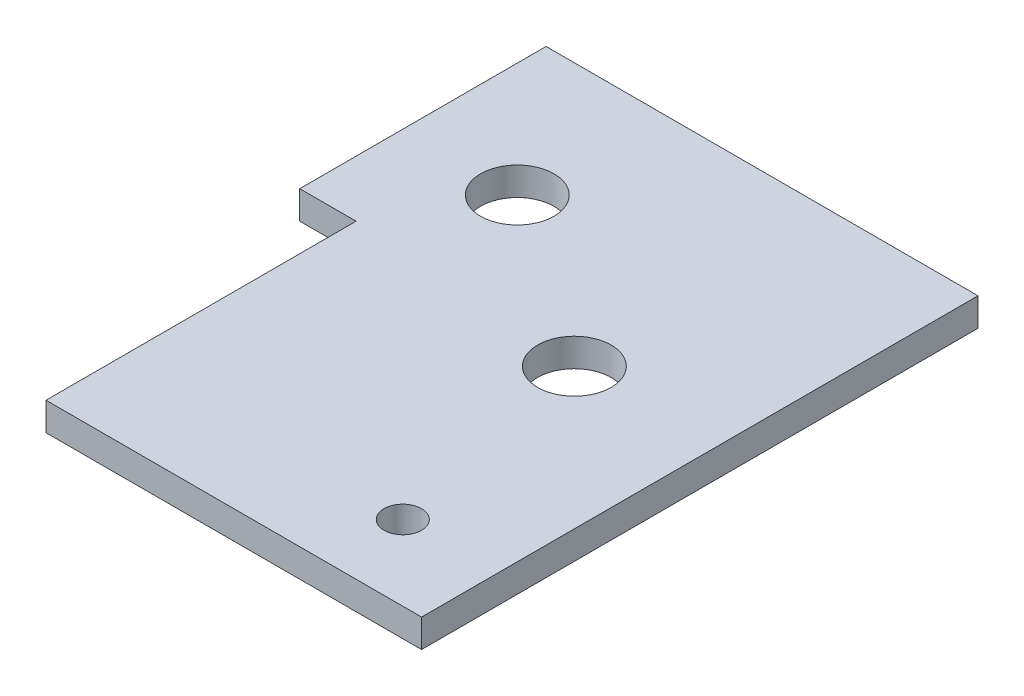
ISO-10303-21;
HEADER;
FILE_DESCRIPTION(('STEP AP214'),'2;1');
FILE_NAME('part.step','',(''),(''),'','','');
FILE_SCHEMA(('AUTOMOTIVE_DESIGN { 1 0 10303 214 1 1 1 1 }'));
ENDSEC;
DATA;
#1=APPLICATION_CONTEXT('core data for automotive mechanical design processes');
#2=APPLICATION_PROTOCOL_DEFINITION('international standard','automotive_design',2000,#1);
#3=PRODUCT_CONTEXT('',#1,'mechanical');
#4=PRODUCT('Part','Part','',(#3));
#5=PRODUCT_RELATED_PRODUCT_CATEGORY('part','',(#4));
#6=PRODUCT_DEFINITION_FORMATION('','',#4);
#7=PRODUCT_DEFINITION_CONTEXT('part definition',#1,'design');
#8=PRODUCT_DEFINITION('design','',#6,#7);
#9=PRODUCT_DEFINITION_SHAPE('','',#8);
#10=(LENGTH_UNIT() NAMED_UNIT(*) SI_UNIT(.MILLI.,.METRE.));
#11=(NAMED_UNIT(*) PLANE_ANGLE_UNIT() SI_UNIT($,.RADIAN.));
#12=(NAMED_UNIT(*) SI_UNIT($,.STERADIAN.) SOLID_ANGLE_UNIT());
#13=UNCERTAINTY_MEASURE_WITH_UNIT(LENGTH_MEASURE(1.E-05),#10,'distance_accuracy_value','');
#14=(GEOMETRIC_REPRESENTATION_CONTEXT(3) GLOBAL_UNCERTAINTY_ASSIGNED_CONTEXT((#13)) GLOBAL_UNIT_ASSIGNED_CONTEXT((#10,
#11,#12)) REPRESENTATION_CONTEXT('',''));
#15=CARTESIAN_POINT('',(0.,0.,0.));
#16=DIRECTION('',(0.,0.,1.));
#17=DIRECTION('',(1.,0.,0.));
#18=AXIS2_PLACEMENT_3D('',#15,#16,#17);
#19=CARTESIAN_POINT('',(0.,3.,-32.2957006320331));
#20=DIRECTION('',(0.,0.,-1.));
#21=DIRECTION('',(-1.,0.,0.));
#22=AXIS2_PLACEMENT_3D('',#19,#20,#21);
#23=PLANE('',#22);
#24=DIRECTION('',(1.,0.,0.));
#25=VECTOR('',#24,1.);
#26=CARTESIAN_POINT('',(0.,0.,-32.2957006320331));
#27=LINE('',#26,#25);
#28=CARTESIAN_POINT('',(106.296761577572,0.,-32.2957006320331));
#29=VERTEX_POINT('',#28);
#30=CARTESIAN_POINT('',(152.296761577573,0.,-32.2957006320331));
#31=VERTEX_POINT('',#30);
#32=EDGE_CURVE('E128',#29,#31,#27,.T.);
#33=ORIENTED_EDGE('',*,*,#32,.F.);
#34=DIRECTION('',(0.,-1.,0.));
#35=VECTOR('',#34,1.);
#36=CARTESIAN_POINT('',(106.296761577572,3.,-32.2957006320331));
#37=LINE('',#36,#35);
#38=CARTESIAN_POINT('',(106.296761577572,3.,-32.2957006320331));
#39=VERTEX_POINT('',#38);
#40=EDGE_CURVE('E11',#39,#29,#37,.T.);
#41=ORIENTED_EDGE('',*,*,#40,.F.);
#42=DIRECTION('',(1.,0.,0.));
#43=VECTOR('',#42,1.);
#44=CARTESIAN_POINT('',(0.,3.,-32.2957006320331));
#45=LINE('',#44,#43);
#46=CARTESIAN_POINT('',(152.296761577573,3.,-32.2957006320331));
#47=VERTEX_POINT('',#46);
#48=EDGE_CURVE('E149',#39,#47,#45,.T.);
#49=ORIENTED_EDGE('',*,*,#48,.T.);
#50=DIRECTION('',(0.,-1.,0.));
#51=VECTOR('',#50,1.);
#52=CARTESIAN_POINT('',(152.296761577573,3.,-32.2957006320331));
#53=LINE('',#52,#51);
#54=EDGE_CURVE('E80',#47,#31,#53,.T.);
#55=ORIENTED_EDGE('',*,*,#54,.T.);
#56=EDGE_LOOP('',(#33,#41,#49,#55));
#57=FACE_BOUND('',#56,.T.);
#58=ADVANCED_FACE('F36',(#57),#23,.T.);
#59=CARTESIAN_POINT('',(106.296761577572,3.,0.));
#60=DIRECTION('',(1.,0.,0.));
#61=DIRECTION('',(0.,0.,-1.));
#62=AXIS2_PLACEMENT_3D('',#59,#60,#61);
#63=PLANE('',#62);
#64=DIRECTION('',(0.,0.,1.));
#65=VECTOR('',#64,1.);
#66=CARTESIAN_POINT('',(106.296761577572,0.,0.));
#67=LINE('',#66,#65);
#68=CARTESIAN_POINT('',(106.296761577572,0.,-6.05517733110575));
#69=VERTEX_POINT('',#68);
#70=EDGE_CURVE('E131',#29,#69,#67,.T.);
#71=ORIENTED_EDGE('',*,*,#70,.T.);
#72=DIRECTION('',(0.,-1.,0.));
#73=VECTOR('',#72,1.);
#74=CARTESIAN_POINT('',(106.296761577572,3.,-6.05517733110575));
#75=LINE('',#74,#73);
#76=CARTESIAN_POINT('',(106.296761577572,3.,-6.05517733110575));
#77=VERTEX_POINT('',#76);
#78=EDGE_CURVE('E44',#77,#69,#75,.T.);
#79=ORIENTED_EDGE('',*,*,#78,.F.);
#80=DIRECTION('',(0.,0.,1.));
#81=VECTOR('',#80,1.);
#82=CARTESIAN_POINT('',(106.296761577572,3.,0.));
#83=LINE('',#82,#81);
#84=EDGE_CURVE('E163',#39,#77,#83,.T.);
#85=ORIENTED_EDGE('',*,*,#84,.F.);
#86=ORIENTED_EDGE('',*,*,#40,.T.);
#87=EDGE_LOOP('',(#71,#79,#85,#86));
#88=FACE_BOUND('',#87,.T.);
#89=ADVANCED_FACE('F166',(#88),#63,.F.);
#90=CARTESIAN_POINT('',(0.,3.,-6.05517733110575));
#91=DIRECTION('',(0.,0.,-1.));
#92=DIRECTION('',(-1.,0.,0.));
#93=AXIS2_PLACEMENT_3D('',#90,#91,#92);
#94=PLANE('',#93);
#95=DIRECTION('',(1.,0.,0.));
#96=VECTOR('',#95,1.);
#97=CARTESIAN_POINT('',(0.,0.,-6.05517733110575));
#98=LINE('',#97,#96);
#99=CARTESIAN_POINT('',(112.296761577573,0.,-6.05517733110575));
#100=VERTEX_POINT('',#99);
#101=EDGE_CURVE('E133',#69,#100,#98,.T.);
#102=ORIENTED_EDGE('',*,*,#101,.T.);
#103=DIRECTION('',(0.,-1.,0.));
#104=VECTOR('',#103,1.);
#105=CARTESIAN_POINT('',(112.296761577573,3.,-6.05517733110575));
#106=LINE('',#105,#104);
#107=CARTESIAN_POINT('',(112.296761577573,3.,-6.05517733110575));
#108=VERTEX_POINT('',#107);
#109=EDGE_CURVE('E112',#108,#100,#106,.T.);
#110=ORIENTED_EDGE('',*,*,#109,.F.);
#111=DIRECTION('',(1.,0.,0.));
#112=VECTOR('',#111,1.);
#113=CARTESIAN_POINT('',(0.,3.,-6.05517733110575));
#114=LINE('',#113,#112);
#115=EDGE_CURVE('E99',#77,#108,#114,.T.);
#116=ORIENTED_EDGE('',*,*,#115,.F.);
#117=ORIENTED_EDGE('',*,*,#78,.T.);
#118=EDGE_LOOP('',(#102,#110,#116,#117));
#119=FACE_BOUND('',#118,.T.);
#120=ADVANCED_FACE('F156',(#119),#94,.F.);
#121=CARTESIAN_POINT('',(112.296761577573,3.,3.30325947032491E-13));
#122=DIRECTION('',(1.,0.,0.));
#123=DIRECTION('',(0.,0.,-1.));
#124=AXIS2_PLACEMENT_3D('',#121,#122,#123);
#125=PLANE('',#124);
#126=DIRECTION('',(0.,0.,1.));
#127=VECTOR('',#126,1.);
#128=CARTESIAN_POINT('',(112.296761577573,0.,3.30325947032491E-13));
#129=LINE('',#128,#127);
#130=CARTESIAN_POINT('',(112.296761577573,0.,26.9698226688942));
#131=VERTEX_POINT('',#130);
#132=EDGE_CURVE('E108',#100,#131,#129,.T.);
#133=ORIENTED_EDGE('',*,*,#132,.T.);
#134=DIRECTION('',(0.,-1.,0.));
#135=VECTOR('',#134,1.);
#136=CARTESIAN_POINT('',(112.296761577573,3.,26.9698226688942));
#137=LINE('',#136,#135);
#138=CARTESIAN_POINT('',(112.296761577573,3.,26.9698226688942));
#139=VERTEX_POINT('',#138);
#140=EDGE_CURVE('E105',#139,#131,#137,.T.);
#141=ORIENTED_EDGE('',*,*,#140,.F.);
#142=DIRECTION('',(0.,0.,1.));
#143=VECTOR('',#142,1.);
#144=CARTESIAN_POINT('',(112.296761577573,3.,3.30325947032491E-13));
#145=LINE('',#144,#143);
#146=EDGE_CURVE('E92',#108,#139,#145,.T.);
#147=ORIENTED_EDGE('',*,*,#146,.F.);
#148=ORIENTED_EDGE('',*,*,#109,.T.);
#149=EDGE_LOOP('',(#133,#141,#147,#148));
#150=FACE_BOUND('',#149,.T.);
#151=ADVANCED_FACE('F106',(#150),#125,.F.);
#152=CARTESIAN_POINT('',(1.4035555357999E-13,3.,26.9698226688948));
#153=DIRECTION('',(0.,0.,1.));
#154=DIRECTION('',(1.,0.,0.));
#155=AXIS2_PLACEMENT_3D('',#152,#153,#154);
#156=PLANE('',#155);
#157=DIRECTION('',(-1.,0.,0.));
#158=VECTOR('',#157,1.);
#159=CARTESIAN_POINT('',(1.4035555357999E-13,0.,26.9698226688948));
#160=LINE('',#159,#158);
#161=CARTESIAN_POINT('',(152.296761577573,0.,26.969822668894));
#162=VERTEX_POINT('',#161);
#163=EDGE_CURVE('E136',#162,#131,#160,.T.);
#164=ORIENTED_EDGE('',*,*,#163,.F.);
#165=DIRECTION('',(0.,-1.,0.));
#166=VECTOR('',#165,1.);
#167=CARTESIAN_POINT('',(152.296761577573,3.,26.969822668894));
#168=LINE('',#167,#166);
#169=CARTESIAN_POINT('',(152.296761577573,3.,26.969822668894));
#170=VERTEX_POINT('',#169);
#171=EDGE_CURVE('E73',#170,#162,#168,.T.);
#172=ORIENTED_EDGE('',*,*,#171,.F.);
#173=DIRECTION('',(-1.,0.,0.));
#174=VECTOR('',#173,1.);
#175=CARTESIAN_POINT('',(1.4035555357999E-13,3.,26.9698226688948));
#176=LINE('',#175,#174);
#177=EDGE_CURVE('E97',#170,#139,#176,.T.);
#178=ORIENTED_EDGE('',*,*,#177,.T.);
#179=ORIENTED_EDGE('',*,*,#140,.T.);
#180=EDGE_LOOP('',(#164,#172,#178,#179));
#181=FACE_BOUND('',#180,.T.);
#182=ADVANCED_FACE('F114',(#181),#156,.T.);
#183=CARTESIAN_POINT('',(137.296761577573,3.,-4.30517733110572));
#184=DIRECTION('',(0.,-1.,0.));
#185=DIRECTION('',(0.,0.,-1.));
#186=AXIS2_PLACEMENT_3D('',#183,#184,#185);
#187=CYLINDRICAL_SURFACE('',#186,3.91500000000018);
#188=CARTESIAN_POINT('',(137.296761577573,3.,-4.30517733110572));
#189=DIRECTION('',(0.,1.,0.));
#190=DIRECTION('',(0.,0.,1.));
#191=AXIS2_PLACEMENT_3D('',#188,#189,#190);
#192=CIRCLE('',#191,3.91500000000018);
#193=CARTESIAN_POINT('',(137.296761577573,3.,-0.390177331105537));
#194=VERTEX_POINT('',#193);
#195=EDGE_CURVE('E122',#194,#194,#192,.F.);
#196=ORIENTED_EDGE('',*,*,#195,.F.);
#197=EDGE_LOOP('',(#196));
#198=FACE_BOUND('',#197,.T.);
#199=CARTESIAN_POINT('',(137.296761577573,0.,-4.30517733110572));
#200=DIRECTION('',(0.,1.,0.));
#201=DIRECTION('',(0.,0.,1.));
#202=AXIS2_PLACEMENT_3D('',#199,#200,#201);
#203=CIRCLE('',#202,3.91500000000018);
#204=CARTESIAN_POINT('',(137.296761577573,0.,-0.390177331105537));
#205=VERTEX_POINT('',#204);
#206=EDGE_CURVE('E143',#205,#205,#203,.F.);
#207=ORIENTED_EDGE('',*,*,#206,.T.);
#208=EDGE_LOOP('',(#207));
#209=FACE_BOUND('',#208,.T.);
#210=ADVANCED_FACE('F178',(#198,#209),#187,.F.);
#211=CARTESIAN_POINT('',(142.296761577573,3.,18.9698226688939));
#212=DIRECTION('',(0.,-1.,0.));
#213=DIRECTION('',(0.,0.,-1.));
#214=AXIS2_PLACEMENT_3D('',#211,#212,#213);
#215=CYLINDRICAL_SURFACE('',#214,2.);
#216=CARTESIAN_POINT('',(142.296761577573,3.,18.9698226688939));
#217=DIRECTION('',(0.,1.,0.));
#218=DIRECTION('',(0.,0.,1.));
#219=AXIS2_PLACEMENT_3D('',#216,#217,#218);
#220=CIRCLE('',#219,2.);
#221=CARTESIAN_POINT('',(142.296761577573,3.,20.9698226688939));
#222=VERTEX_POINT('',#221);
#223=EDGE_CURVE('E116',#222,#222,#220,.F.);
#224=ORIENTED_EDGE('',*,*,#223,.F.);
#225=EDGE_LOOP('',(#224));
#226=FACE_BOUND('',#225,.T.);
#227=CARTESIAN_POINT('',(142.296761577573,0.,18.9698226688939));
#228=DIRECTION('',(0.,1.,0.));
#229=DIRECTION('',(0.,0.,1.));
#230=AXIS2_PLACEMENT_3D('',#227,#228,#229);
#231=CIRCLE('',#230,2.);
#232=CARTESIAN_POINT('',(142.296761577573,0.,20.9698226688939));
#233=VERTEX_POINT('',#232);
#234=EDGE_CURVE('E140',#233,#233,#231,.F.);
#235=ORIENTED_EDGE('',*,*,#234,.T.);
#236=EDGE_LOOP('',(#235));
#237=FACE_BOUND('',#236,.T.);
#238=ADVANCED_FACE('F182',(#226,#237),#215,.F.);
#239=CARTESIAN_POINT('',(152.296761577573,3.,0.));
#240=DIRECTION('',(-1.,0.,0.));
#241=DIRECTION('',(0.,0.,1.));
#242=AXIS2_PLACEMENT_3D('',#239,#240,#241);
#243=PLANE('',#242);
#244=DIRECTION('',(0.,0.,-1.));
#245=VECTOR('',#244,1.);
#246=CARTESIAN_POINT('',(152.296761577573,0.,0.));
#247=LINE('',#246,#245);
#248=EDGE_CURVE('E138',#162,#31,#247,.T.);
#249=ORIENTED_EDGE('',*,*,#248,.T.);
#250=ORIENTED_EDGE('',*,*,#54,.F.);
#251=DIRECTION('',(0.,0.,-1.));
#252=VECTOR('',#251,1.);
#253=CARTESIAN_POINT('',(152.296761577573,3.,0.));
#254=LINE('',#253,#252);
#255=EDGE_CURVE('E52',#170,#47,#254,.T.);
#256=ORIENTED_EDGE('',*,*,#255,.F.);
#257=ORIENTED_EDGE('',*,*,#171,.T.);
#258=EDGE_LOOP('',(#249,#250,#256,#257));
#259=FACE_BOUND('',#258,.T.);
#260=ADVANCED_FACE('F162',(#259),#243,.F.);
#261=CARTESIAN_POINT('',(118.466761577572,3.,-17.0551773311057));
#262=DIRECTION('',(0.,-1.,0.));
#263=DIRECTION('',(0.,0.,-1.));
#264=AXIS2_PLACEMENT_3D('',#261,#262,#263);
#265=CYLINDRICAL_SURFACE('',#264,3.915);
#266=CARTESIAN_POINT('',(118.466761577572,3.,-17.0551773311057));
#267=DIRECTION('',(0.,1.,0.));
#268=DIRECTION('',(0.,0.,1.));
#269=AXIS2_PLACEMENT_3D('',#266,#267,#268);
#270=CIRCLE('',#269,3.915);
#271=CARTESIAN_POINT('',(118.466761577572,3.,-13.1401773311057));
#272=VERTEX_POINT('',#271);
#273=EDGE_CURVE('E125',#272,#272,#270,.F.);
#274=ORIENTED_EDGE('',*,*,#273,.F.);
#275=EDGE_LOOP('',(#274));
#276=FACE_BOUND('',#275,.T.);
#277=CARTESIAN_POINT('',(118.466761577572,0.,-17.0551773311057));
#278=DIRECTION('',(0.,1.,0.));
#279=DIRECTION('',(0.,0.,1.));
#280=AXIS2_PLACEMENT_3D('',#277,#278,#279);
#281=CIRCLE('',#280,3.915);
#282=CARTESIAN_POINT('',(118.466761577572,0.,-13.1401773311057));
#283=VERTEX_POINT('',#282);
#284=EDGE_CURVE('E146',#283,#283,#281,.F.);
#285=ORIENTED_EDGE('',*,*,#284,.T.);
#286=EDGE_LOOP('',(#285));
#287=FACE_BOUND('',#286,.T.);
#288=ADVANCED_FACE('F181',(#276,#287),#265,.F.);
#289=CARTESIAN_POINT('',(0.,3.,0.));
#290=DIRECTION('',(0.,1.,0.));
#291=DIRECTION('',(0.,0.,1.));
#292=AXIS2_PLACEMENT_3D('',#289,#290,#291);
#293=PLANE('',#292);
#294=ORIENTED_EDGE('',*,*,#48,.F.);
#295=ORIENTED_EDGE('',*,*,#84,.T.);
#296=ORIENTED_EDGE('',*,*,#115,.T.);
#297=ORIENTED_EDGE('',*,*,#146,.T.);
#298=ORIENTED_EDGE('',*,*,#177,.F.);
#299=ORIENTED_EDGE('',*,*,#255,.T.);
#300=EDGE_LOOP('',(#294,#295,#296,#297,#298,#299));
#301=FACE_BOUND('',#300,.T.);
#302=ORIENTED_EDGE('',*,*,#223,.T.);
#303=EDGE_LOOP('',(#302));
#304=FACE_BOUND('',#303,.T.);
#305=ORIENTED_EDGE('',*,*,#195,.T.);
#306=EDGE_LOOP('',(#305));
#307=FACE_BOUND('',#306,.T.);
#308=ORIENTED_EDGE('',*,*,#273,.T.);
#309=EDGE_LOOP('',(#308));
#310=FACE_BOUND('',#309,.T.);
#311=ADVANCED_FACE('F94',(#301,#304,#307,#310),#293,.T.);
#312=CARTESIAN_POINT('',(0.,0.,0.));
#313=DIRECTION('',(0.,1.,0.));
#314=DIRECTION('',(0.,0.,1.));
#315=AXIS2_PLACEMENT_3D('',#312,#313,#314);
#316=PLANE('',#315);
#317=ORIENTED_EDGE('',*,*,#32,.T.);
#318=ORIENTED_EDGE('',*,*,#248,.F.);
#319=ORIENTED_EDGE('',*,*,#163,.T.);
#320=ORIENTED_EDGE('',*,*,#132,.F.);
#321=ORIENTED_EDGE('',*,*,#101,.F.);
#322=ORIENTED_EDGE('',*,*,#70,.F.);
#323=EDGE_LOOP('',(#317,#318,#319,#320,#321,#322));
#324=FACE_BOUND('',#323,.T.);
#325=ORIENTED_EDGE('',*,*,#234,.F.);
#326=EDGE_LOOP('',(#325));
#327=FACE_BOUND('',#326,.T.);
#328=ORIENTED_EDGE('',*,*,#206,.F.);
#329=EDGE_LOOP('',(#328));
#330=FACE_BOUND('',#329,.T.);
#331=ORIENTED_EDGE('',*,*,#284,.F.);
#332=EDGE_LOOP('',(#331));
#333=FACE_BOUND('',#332,.T.);
#334=ADVANCED_FACE('F160',(#324,#327,#330,#333),#316,.F.);
#335=CLOSED_SHELL('',(#58,#89,#120,#151,#182,#210,#238,#260,#288,#311,#334));
#336=MANIFOLD_SOLID_BREP('B2',#335);
#337=ADVANCED_BREP_SHAPE_REPRESENTATION('',(#18,#336),#14);
#338=SHAPE_DEFINITION_REPRESENTATION(#9,#337);
ENDSEC;
END-ISO-10303-21;
